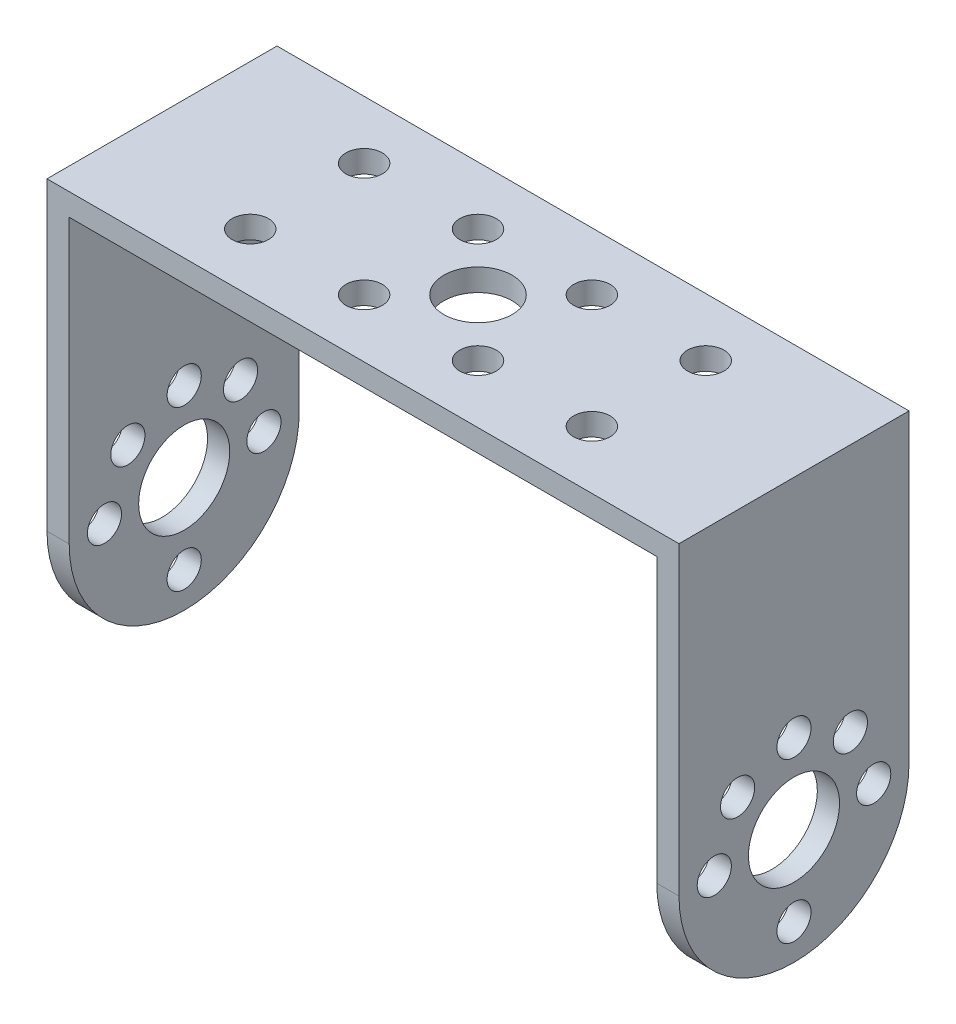
ISO-10303-21;
HEADER;
FILE_DESCRIPTION(('STEP AP214'),'2;1');
FILE_NAME('part.step','',(''),(''),'','','');
FILE_SCHEMA(('AUTOMOTIVE_DESIGN { 1 0 10303 214 1 1 1 1 }'));
ENDSEC;
DATA;
#1=APPLICATION_CONTEXT('core data for automotive mechanical design processes');
#2=APPLICATION_PROTOCOL_DEFINITION('international standard','automotive_design',2000,#1);
#3=PRODUCT_CONTEXT('',#1,'mechanical');
#4=PRODUCT('Part','Part','',(#3));
#5=PRODUCT_RELATED_PRODUCT_CATEGORY('part','',(#4));
#6=PRODUCT_DEFINITION_FORMATION('','',#4);
#7=PRODUCT_DEFINITION_CONTEXT('part definition',#1,'design');
#8=PRODUCT_DEFINITION('design','',#6,#7);
#9=PRODUCT_DEFINITION_SHAPE('','',#8);
#10=(LENGTH_UNIT() NAMED_UNIT(*) SI_UNIT(.MILLI.,.METRE.));
#11=(NAMED_UNIT(*) PLANE_ANGLE_UNIT() SI_UNIT($,.RADIAN.));
#12=(NAMED_UNIT(*) SI_UNIT($,.STERADIAN.) SOLID_ANGLE_UNIT());
#13=UNCERTAINTY_MEASURE_WITH_UNIT(LENGTH_MEASURE(1.E-05),#10,'distance_accuracy_value','');
#14=(GEOMETRIC_REPRESENTATION_CONTEXT(3) GLOBAL_UNCERTAINTY_ASSIGNED_CONTEXT((#13)) GLOBAL_UNIT_ASSIGNED_CONTEXT((#10,
#11,#12)) REPRESENTATION_CONTEXT('',''));
#15=CARTESIAN_POINT('',(0.,0.,0.));
#16=DIRECTION('',(0.,0.,1.));
#17=DIRECTION('',(1.,0.,0.));
#18=AXIS2_PLACEMENT_3D('',#15,#16,#17);
#19=CARTESIAN_POINT('',(-25.8,0.,10.1));
#20=DIRECTION('',(-1.,0.,0.));
#21=DIRECTION('',(0.,-1.,0.));
#22=AXIS2_PLACEMENT_3D('',#19,#20,#21);
#23=PLANE('',#22);
#24=CARTESIAN_POINT('',(-25.8,15.0497474683058,-4.94974746830583));
#25=DIRECTION('',(-1.,0.,0.));
#26=DIRECTION('',(0.,-1.,0.));
#27=AXIS2_PLACEMENT_3D('',#24,#25,#26);
#28=CIRCLE('',#27,1.5);
#29=CARTESIAN_POINT('',(-25.8,13.5497474683058,-4.94974746830583));
#30=VERTEX_POINT('',#29);
#31=EDGE_CURVE('E223',#30,#30,#28,.T.);
#32=ORIENTED_EDGE('',*,*,#31,.T.);
#33=EDGE_LOOP('',(#32));
#34=FACE_BOUND('',#33,.T.);
#35=CARTESIAN_POINT('',(-25.8,10.1,-7.));
#36=DIRECTION('',(-1.,0.,0.));
#37=DIRECTION('',(0.,-1.,0.));
#38=AXIS2_PLACEMENT_3D('',#35,#36,#37);
#39=CIRCLE('',#38,1.5);
#40=CARTESIAN_POINT('',(-25.8,8.60000000000001,-7.));
#41=VERTEX_POINT('',#40);
#42=EDGE_CURVE('E236',#41,#41,#39,.T.);
#43=ORIENTED_EDGE('',*,*,#42,.T.);
#44=EDGE_LOOP('',(#43));
#45=FACE_BOUND('',#44,.T.);
#46=CARTESIAN_POINT('',(-25.8,3.10000000000001,0.));
#47=DIRECTION('',(-1.,0.,0.));
#48=DIRECTION('',(0.,-1.,0.));
#49=AXIS2_PLACEMENT_3D('',#46,#47,#48);
#50=CIRCLE('',#49,1.5);
#51=CARTESIAN_POINT('',(-25.8,1.60000000000001,0.));
#52=VERTEX_POINT('',#51);
#53=EDGE_CURVE('E242',#52,#52,#50,.T.);
#54=ORIENTED_EDGE('',*,*,#53,.T.);
#55=EDGE_LOOP('',(#54));
#56=FACE_BOUND('',#55,.T.);
#57=CARTESIAN_POINT('',(-25.8,17.1,0.));
#58=DIRECTION('',(-1.,0.,0.));
#59=DIRECTION('',(0.,-1.,0.));
#60=AXIS2_PLACEMENT_3D('',#57,#58,#59);
#61=CIRCLE('',#60,1.5);
#62=CARTESIAN_POINT('',(-25.8,15.6,0.));
#63=VERTEX_POINT('',#62);
#64=EDGE_CURVE('E248',#63,#63,#61,.T.);
#65=ORIENTED_EDGE('',*,*,#64,.T.);
#66=EDGE_LOOP('',(#65));
#67=FACE_BOUND('',#66,.T.);
#68=CARTESIAN_POINT('',(-25.8,15.0497474683058,4.94974746830583));
#69=DIRECTION('',(-1.,0.,0.));
#70=DIRECTION('',(0.,-1.,0.));
#71=AXIS2_PLACEMENT_3D('',#68,#69,#70);
#72=CIRCLE('',#71,1.5);
#73=CARTESIAN_POINT('',(-25.8,13.5497474683058,4.94974746830583));
#74=VERTEX_POINT('',#73);
#75=EDGE_CURVE('E254',#74,#74,#72,.T.);
#76=ORIENTED_EDGE('',*,*,#75,.T.);
#77=EDGE_LOOP('',(#76));
#78=FACE_BOUND('',#77,.T.);
#79=CARTESIAN_POINT('',(-25.8,10.1,7.));
#80=DIRECTION('',(-1.,0.,0.));
#81=DIRECTION('',(0.,-1.,0.));
#82=AXIS2_PLACEMENT_3D('',#79,#80,#81);
#83=CIRCLE('',#82,1.5);
#84=CARTESIAN_POINT('',(-25.8,8.60000000000001,7.));
#85=VERTEX_POINT('',#84);
#86=EDGE_CURVE('E260',#85,#85,#83,.T.);
#87=ORIENTED_EDGE('',*,*,#86,.T.);
#88=EDGE_LOOP('',(#87));
#89=FACE_BOUND('',#88,.T.);
#90=CARTESIAN_POINT('',(-25.8,10.1,0.));
#91=DIRECTION('',(-1.,0.,0.));
#92=DIRECTION('',(0.,-1.,0.));
#93=AXIS2_PLACEMENT_3D('',#90,#91,#92);
#94=CIRCLE('',#93,4.);
#95=CARTESIAN_POINT('',(-25.8,6.10000000000001,0.));
#96=VERTEX_POINT('',#95);
#97=EDGE_CURVE('E266',#96,#96,#94,.T.);
#98=ORIENTED_EDGE('',*,*,#97,.T.);
#99=EDGE_LOOP('',(#98));
#100=FACE_BOUND('',#99,.T.);
#101=CARTESIAN_POINT('',(-25.8,10.1,0.));
#102=DIRECTION('',(-1.,0.,0.));
#103=DIRECTION('',(0.,-1.,0.));
#104=AXIS2_PLACEMENT_3D('',#101,#102,#103);
#105=CIRCLE('',#104,10.1);
#106=CARTESIAN_POINT('',(-25.8,10.1,-10.1));
#107=VERTEX_POINT('',#106);
#108=CARTESIAN_POINT('',(-25.8,10.1,10.1));
#109=VERTEX_POINT('',#108);
#110=EDGE_CURVE('E53',#107,#109,#105,.T.);
#111=ORIENTED_EDGE('',*,*,#110,.F.);
#112=DIRECTION('',(0.,1.,0.));
#113=VECTOR('',#112,1.);
#114=CARTESIAN_POINT('',(-25.8,0.,-10.1));
#115=LINE('',#114,#113);
#116=CARTESIAN_POINT('',(-25.8,34.95,-10.1));
#117=VERTEX_POINT('',#116);
#118=EDGE_CURVE('E110',#107,#117,#115,.T.);
#119=ORIENTED_EDGE('',*,*,#118,.T.);
#120=DIRECTION('',(0.,0.,-1.));
#121=VECTOR('',#120,1.);
#122=CARTESIAN_POINT('',(-25.8,34.95,10.1));
#123=LINE('',#122,#121);
#124=CARTESIAN_POINT('',(-25.8,34.95,10.1));
#125=VERTEX_POINT('',#124);
#126=EDGE_CURVE('E134',#125,#117,#123,.T.);
#127=ORIENTED_EDGE('',*,*,#126,.F.);
#128=DIRECTION('',(0.,1.,0.));
#129=VECTOR('',#128,1.);
#130=CARTESIAN_POINT('',(-25.8,0.,10.1));
#131=LINE('',#130,#129);
#132=EDGE_CURVE('E117',#109,#125,#131,.T.);
#133=ORIENTED_EDGE('',*,*,#132,.F.);
#134=EDGE_LOOP('',(#111,#119,#127,#133));
#135=FACE_BOUND('',#134,.T.);
#136=ADVANCED_FACE('F32',(#34,#45,#56,#67,#78,#89,#100,#135),#23,.F.);
#137=CARTESIAN_POINT('',(25.8,0.,10.1));
#138=DIRECTION('',(1.,0.,0.));
#139=DIRECTION('',(0.,1.,0.));
#140=AXIS2_PLACEMENT_3D('',#137,#138,#139);
#141=PLANE('',#140);
#142=CARTESIAN_POINT('',(25.8,15.0497474683058,-4.94974746830583));
#143=DIRECTION('',(1.,0.,0.));
#144=DIRECTION('',(0.,1.,0.));
#145=AXIS2_PLACEMENT_3D('',#142,#143,#144);
#146=CIRCLE('',#145,1.5);
#147=CARTESIAN_POINT('',(25.8,16.5497474683058,-4.94974746830583));
#148=VERTEX_POINT('',#147);
#149=EDGE_CURVE('E233',#148,#148,#146,.T.);
#150=ORIENTED_EDGE('',*,*,#149,.T.);
#151=EDGE_LOOP('',(#150));
#152=FACE_BOUND('',#151,.T.);
#153=CARTESIAN_POINT('',(25.8,10.1,-7.));
#154=DIRECTION('',(1.,0.,0.));
#155=DIRECTION('',(0.,1.,0.));
#156=AXIS2_PLACEMENT_3D('',#153,#154,#155);
#157=CIRCLE('',#156,1.5);
#158=CARTESIAN_POINT('',(25.8,11.6,-7.));
#159=VERTEX_POINT('',#158);
#160=EDGE_CURVE('E239',#159,#159,#157,.T.);
#161=ORIENTED_EDGE('',*,*,#160,.T.);
#162=EDGE_LOOP('',(#161));
#163=FACE_BOUND('',#162,.T.);
#164=CARTESIAN_POINT('',(25.8,3.1,0.));
#165=DIRECTION('',(1.,0.,0.));
#166=DIRECTION('',(0.,1.,0.));
#167=AXIS2_PLACEMENT_3D('',#164,#165,#166);
#168=CIRCLE('',#167,1.5);
#169=CARTESIAN_POINT('',(25.8,4.6,0.));
#170=VERTEX_POINT('',#169);
#171=EDGE_CURVE('E245',#170,#170,#168,.T.);
#172=ORIENTED_EDGE('',*,*,#171,.T.);
#173=EDGE_LOOP('',(#172));
#174=FACE_BOUND('',#173,.T.);
#175=CARTESIAN_POINT('',(25.8,17.1,0.));
#176=DIRECTION('',(1.,0.,0.));
#177=DIRECTION('',(0.,1.,0.));
#178=AXIS2_PLACEMENT_3D('',#175,#176,#177);
#179=CIRCLE('',#178,1.5);
#180=CARTESIAN_POINT('',(25.8,18.6,0.));
#181=VERTEX_POINT('',#180);
#182=EDGE_CURVE('E251',#181,#181,#179,.T.);
#183=ORIENTED_EDGE('',*,*,#182,.T.);
#184=EDGE_LOOP('',(#183));
#185=FACE_BOUND('',#184,.T.);
#186=CARTESIAN_POINT('',(25.8,15.0497474683058,4.94974746830583));
#187=DIRECTION('',(1.,0.,0.));
#188=DIRECTION('',(0.,1.,0.));
#189=AXIS2_PLACEMENT_3D('',#186,#187,#188);
#190=CIRCLE('',#189,1.5);
#191=CARTESIAN_POINT('',(25.8,16.5497474683058,4.94974746830583));
#192=VERTEX_POINT('',#191);
#193=EDGE_CURVE('E257',#192,#192,#190,.T.);
#194=ORIENTED_EDGE('',*,*,#193,.T.);
#195=EDGE_LOOP('',(#194));
#196=FACE_BOUND('',#195,.T.);
#197=CARTESIAN_POINT('',(25.8,10.1,7.));
#198=DIRECTION('',(1.,0.,0.));
#199=DIRECTION('',(0.,1.,0.));
#200=AXIS2_PLACEMENT_3D('',#197,#198,#199);
#201=CIRCLE('',#200,1.5);
#202=CARTESIAN_POINT('',(25.8,11.6,7.));
#203=VERTEX_POINT('',#202);
#204=EDGE_CURVE('E263',#203,#203,#201,.T.);
#205=ORIENTED_EDGE('',*,*,#204,.T.);
#206=EDGE_LOOP('',(#205));
#207=FACE_BOUND('',#206,.T.);
#208=CARTESIAN_POINT('',(25.8,10.1,0.));
#209=DIRECTION('',(1.,0.,0.));
#210=DIRECTION('',(0.,1.,0.));
#211=AXIS2_PLACEMENT_3D('',#208,#209,#210);
#212=CIRCLE('',#211,4.);
#213=CARTESIAN_POINT('',(25.8,14.1,0.));
#214=VERTEX_POINT('',#213);
#215=EDGE_CURVE('E269',#214,#214,#212,.T.);
#216=ORIENTED_EDGE('',*,*,#215,.T.);
#217=EDGE_LOOP('',(#216));
#218=FACE_BOUND('',#217,.T.);
#219=DIRECTION('',(0.,-1.,0.));
#220=VECTOR('',#219,1.);
#221=CARTESIAN_POINT('',(25.8,0.,-10.1));
#222=LINE('',#221,#220);
#223=CARTESIAN_POINT('',(25.8,34.95,-10.1));
#224=VERTEX_POINT('',#223);
#225=CARTESIAN_POINT('',(25.8,10.1,-10.1));
#226=VERTEX_POINT('',#225);
#227=EDGE_CURVE('E158',#224,#226,#222,.T.);
#228=ORIENTED_EDGE('',*,*,#227,.T.);
#229=CARTESIAN_POINT('',(25.8,10.1,0.));
#230=DIRECTION('',(1.,0.,0.));
#231=DIRECTION('',(0.,1.,0.));
#232=AXIS2_PLACEMENT_3D('',#229,#230,#231);
#233=CIRCLE('',#232,10.1);
#234=CARTESIAN_POINT('',(25.8,10.1,10.1));
#235=VERTEX_POINT('',#234);
#236=EDGE_CURVE('E166',#235,#226,#233,.T.);
#237=ORIENTED_EDGE('',*,*,#236,.F.);
#238=DIRECTION('',(0.,-1.,0.));
#239=VECTOR('',#238,1.);
#240=CARTESIAN_POINT('',(25.8,0.,10.1));
#241=LINE('',#240,#239);
#242=CARTESIAN_POINT('',(25.8,34.95,10.1));
#243=VERTEX_POINT('',#242);
#244=EDGE_CURVE('E143',#243,#235,#241,.T.);
#245=ORIENTED_EDGE('',*,*,#244,.F.);
#246=DIRECTION('',(0.,0.,-1.));
#247=VECTOR('',#246,1.);
#248=CARTESIAN_POINT('',(25.8,34.95,10.1));
#249=LINE('',#248,#247);
#250=EDGE_CURVE('E131',#243,#224,#249,.T.);
#251=ORIENTED_EDGE('',*,*,#250,.T.);
#252=EDGE_LOOP('',(#228,#237,#245,#251));
#253=FACE_BOUND('',#252,.T.);
#254=ADVANCED_FACE('F328',(#152,#163,#174,#185,#196,#207,#218,#253),#141,.F.);
#255=CARTESIAN_POINT('',(27.75,36.9,10.1));
#256=DIRECTION('',(-1.,0.,0.));
#257=DIRECTION('',(0.,-1.,0.));
#258=AXIS2_PLACEMENT_3D('',#255,#256,#257);
#259=PLANE('',#258);
#260=CARTESIAN_POINT('',(27.75,15.0497474683058,-4.94974746830583));
#261=DIRECTION('',(1.,0.,0.));
#262=DIRECTION('',(0.,-1.,0.));
#263=AXIS2_PLACEMENT_3D('',#260,#261,#262);
#264=CIRCLE('',#263,1.5);
#265=CARTESIAN_POINT('',(27.75,13.5497474683058,-4.94974746830583));
#266=VERTEX_POINT('',#265);
#267=EDGE_CURVE('E279',#266,#266,#264,.T.);
#268=ORIENTED_EDGE('',*,*,#267,.F.);
#269=EDGE_LOOP('',(#268));
#270=FACE_BOUND('',#269,.T.);
#271=CARTESIAN_POINT('',(27.75,10.1,-7.));
#272=DIRECTION('',(1.,0.,0.));
#273=DIRECTION('',(0.,-1.,0.));
#274=AXIS2_PLACEMENT_3D('',#271,#272,#273);
#275=CIRCLE('',#274,1.5);
#276=CARTESIAN_POINT('',(27.75,8.6,-7.));
#277=VERTEX_POINT('',#276);
#278=EDGE_CURVE('E285',#277,#277,#275,.T.);
#279=ORIENTED_EDGE('',*,*,#278,.F.);
#280=EDGE_LOOP('',(#279));
#281=FACE_BOUND('',#280,.T.);
#282=CARTESIAN_POINT('',(27.75,3.1,0.));
#283=DIRECTION('',(1.,0.,0.));
#284=DIRECTION('',(0.,1.,0.));
#285=AXIS2_PLACEMENT_3D('',#282,#283,#284);
#286=CIRCLE('',#285,1.5);
#287=CARTESIAN_POINT('',(27.75,4.6,0.));
#288=VERTEX_POINT('',#287);
#289=EDGE_CURVE('E291',#288,#288,#286,.T.);
#290=ORIENTED_EDGE('',*,*,#289,.F.);
#291=EDGE_LOOP('',(#290));
#292=FACE_BOUND('',#291,.T.);
#293=CARTESIAN_POINT('',(27.75,17.1,0.));
#294=DIRECTION('',(1.,0.,0.));
#295=DIRECTION('',(0.,1.,0.));
#296=AXIS2_PLACEMENT_3D('',#293,#294,#295);
#297=CIRCLE('',#296,1.5);
#298=CARTESIAN_POINT('',(27.75,18.6,0.));
#299=VERTEX_POINT('',#298);
#300=EDGE_CURVE('E297',#299,#299,#297,.T.);
#301=ORIENTED_EDGE('',*,*,#300,.F.);
#302=EDGE_LOOP('',(#301));
#303=FACE_BOUND('',#302,.T.);
#304=CARTESIAN_POINT('',(27.75,15.0497474683058,4.94974746830583));
#305=DIRECTION('',(1.,0.,0.));
#306=DIRECTION('',(0.,1.,0.));
#307=AXIS2_PLACEMENT_3D('',#304,#305,#306);
#308=CIRCLE('',#307,1.5);
#309=CARTESIAN_POINT('',(27.75,16.5497474683058,4.94974746830583));
#310=VERTEX_POINT('',#309);
#311=EDGE_CURVE('E303',#310,#310,#308,.T.);
#312=ORIENTED_EDGE('',*,*,#311,.F.);
#313=EDGE_LOOP('',(#312));
#314=FACE_BOUND('',#313,.T.);
#315=CARTESIAN_POINT('',(27.75,10.1,7.));
#316=DIRECTION('',(1.,0.,0.));
#317=DIRECTION('',(0.,1.,0.));
#318=AXIS2_PLACEMENT_3D('',#315,#316,#317);
#319=CIRCLE('',#318,1.5);
#320=CARTESIAN_POINT('',(27.75,11.6,7.));
#321=VERTEX_POINT('',#320);
#322=EDGE_CURVE('E309',#321,#321,#319,.T.);
#323=ORIENTED_EDGE('',*,*,#322,.F.);
#324=EDGE_LOOP('',(#323));
#325=FACE_BOUND('',#324,.T.);
#326=CARTESIAN_POINT('',(27.75,10.1,0.));
#327=DIRECTION('',(1.,0.,0.));
#328=DIRECTION('',(0.,1.,0.));
#329=AXIS2_PLACEMENT_3D('',#326,#327,#328);
#330=CIRCLE('',#329,4.);
#331=CARTESIAN_POINT('',(27.75,14.1,0.));
#332=VERTEX_POINT('',#331);
#333=EDGE_CURVE('E273',#332,#332,#330,.T.);
#334=ORIENTED_EDGE('',*,*,#333,.F.);
#335=EDGE_LOOP('',(#334));
#336=FACE_BOUND('',#335,.T.);
#337=CARTESIAN_POINT('',(27.75,10.1,0.));
#338=DIRECTION('',(1.,0.,0.));
#339=DIRECTION('',(0.,1.,0.));
#340=AXIS2_PLACEMENT_3D('',#337,#338,#339);
#341=CIRCLE('',#340,10.1);
#342=CARTESIAN_POINT('',(27.75,10.1,10.1));
#343=VERTEX_POINT('',#342);
#344=CARTESIAN_POINT('',(27.75,10.1,-10.1));
#345=VERTEX_POINT('',#344);
#346=EDGE_CURVE('E45',#343,#345,#341,.T.);
#347=ORIENTED_EDGE('',*,*,#346,.T.);
#348=DIRECTION('',(0.,1.,0.));
#349=VECTOR('',#348,1.);
#350=CARTESIAN_POINT('',(27.75,36.9,-10.1));
#351=LINE('',#350,#349);
#352=CARTESIAN_POINT('',(27.75,36.9,-10.1));
#353=VERTEX_POINT('',#352);
#354=EDGE_CURVE('E122',#345,#353,#351,.T.);
#355=ORIENTED_EDGE('',*,*,#354,.T.);
#356=DIRECTION('',(0.,0.,-1.));
#357=VECTOR('',#356,1.);
#358=CARTESIAN_POINT('',(27.75,36.9,10.1));
#359=LINE('',#358,#357);
#360=CARTESIAN_POINT('',(27.75,36.9,10.1));
#361=VERTEX_POINT('',#360);
#362=EDGE_CURVE('E127',#361,#353,#359,.T.);
#363=ORIENTED_EDGE('',*,*,#362,.F.);
#364=DIRECTION('',(0.,1.,0.));
#365=VECTOR('',#364,1.);
#366=CARTESIAN_POINT('',(27.75,36.9,10.1));
#367=LINE('',#366,#365);
#368=EDGE_CURVE('E140',#343,#361,#367,.T.);
#369=ORIENTED_EDGE('',*,*,#368,.F.);
#370=EDGE_LOOP('',(#347,#355,#363,#369));
#371=FACE_BOUND('',#370,.T.);
#372=ADVANCED_FACE('F146',(#270,#281,#292,#303,#314,#325,#336,#371),#259,.F.);
#373=CARTESIAN_POINT('',(-27.75,36.9,10.1));
#374=DIRECTION('',(1.,0.,0.));
#375=DIRECTION('',(0.,1.,0.));
#376=AXIS2_PLACEMENT_3D('',#373,#374,#375);
#377=PLANE('',#376);
#378=CARTESIAN_POINT('',(-27.75,15.0497474683058,-4.94974746830583));
#379=DIRECTION('',(1.,0.,0.));
#380=DIRECTION('',(0.,-1.,0.));
#381=AXIS2_PLACEMENT_3D('',#378,#379,#380);
#382=CIRCLE('',#381,1.5);
#383=CARTESIAN_POINT('',(-27.75,13.5497474683058,-4.94974746830583));
#384=VERTEX_POINT('',#383);
#385=EDGE_CURVE('E282',#384,#384,#382,.T.);
#386=ORIENTED_EDGE('',*,*,#385,.T.);
#387=EDGE_LOOP('',(#386));
#388=FACE_BOUND('',#387,.T.);
#389=CARTESIAN_POINT('',(-27.75,10.1,-7.));
#390=DIRECTION('',(1.,0.,0.));
#391=DIRECTION('',(0.,-1.,0.));
#392=AXIS2_PLACEMENT_3D('',#389,#390,#391);
#393=CIRCLE('',#392,1.5);
#394=CARTESIAN_POINT('',(-27.75,8.60000000000001,-7.));
#395=VERTEX_POINT('',#394);
#396=EDGE_CURVE('E288',#395,#395,#393,.T.);
#397=ORIENTED_EDGE('',*,*,#396,.T.);
#398=EDGE_LOOP('',(#397));
#399=FACE_BOUND('',#398,.T.);
#400=CARTESIAN_POINT('',(-27.75,3.10000000000001,0.));
#401=DIRECTION('',(1.,0.,0.));
#402=DIRECTION('',(0.,1.,0.));
#403=AXIS2_PLACEMENT_3D('',#400,#401,#402);
#404=CIRCLE('',#403,1.5);
#405=CARTESIAN_POINT('',(-27.75,4.60000000000001,0.));
#406=VERTEX_POINT('',#405);
#407=EDGE_CURVE('E294',#406,#406,#404,.T.);
#408=ORIENTED_EDGE('',*,*,#407,.T.);
#409=EDGE_LOOP('',(#408));
#410=FACE_BOUND('',#409,.T.);
#411=CARTESIAN_POINT('',(-27.75,17.1,0.));
#412=DIRECTION('',(1.,0.,0.));
#413=DIRECTION('',(0.,1.,0.));
#414=AXIS2_PLACEMENT_3D('',#411,#412,#413);
#415=CIRCLE('',#414,1.5);
#416=CARTESIAN_POINT('',(-27.75,18.6,0.));
#417=VERTEX_POINT('',#416);
#418=EDGE_CURVE('E300',#417,#417,#415,.T.);
#419=ORIENTED_EDGE('',*,*,#418,.T.);
#420=EDGE_LOOP('',(#419));
#421=FACE_BOUND('',#420,.T.);
#422=CARTESIAN_POINT('',(-27.75,15.0497474683058,4.94974746830583));
#423=DIRECTION('',(1.,0.,0.));
#424=DIRECTION('',(0.,1.,0.));
#425=AXIS2_PLACEMENT_3D('',#422,#423,#424);
#426=CIRCLE('',#425,1.5);
#427=CARTESIAN_POINT('',(-27.75,16.5497474683058,4.94974746830583));
#428=VERTEX_POINT('',#427);
#429=EDGE_CURVE('E306',#428,#428,#426,.T.);
#430=ORIENTED_EDGE('',*,*,#429,.T.);
#431=EDGE_LOOP('',(#430));
#432=FACE_BOUND('',#431,.T.);
#433=CARTESIAN_POINT('',(-27.75,10.1,7.));
#434=DIRECTION('',(1.,0.,0.));
#435=DIRECTION('',(0.,1.,0.));
#436=AXIS2_PLACEMENT_3D('',#433,#434,#435);
#437=CIRCLE('',#436,1.5);
#438=CARTESIAN_POINT('',(-27.75,11.6,7.));
#439=VERTEX_POINT('',#438);
#440=EDGE_CURVE('E276',#439,#439,#437,.T.);
#441=ORIENTED_EDGE('',*,*,#440,.T.);
#442=EDGE_LOOP('',(#441));
#443=FACE_BOUND('',#442,.T.);
#444=CARTESIAN_POINT('',(-27.75,10.1,0.));
#445=DIRECTION('',(1.,0.,0.));
#446=DIRECTION('',(0.,1.,0.));
#447=AXIS2_PLACEMENT_3D('',#444,#445,#446);
#448=CIRCLE('',#447,4.);
#449=CARTESIAN_POINT('',(-27.75,14.1,0.));
#450=VERTEX_POINT('',#449);
#451=EDGE_CURVE('E272',#450,#450,#448,.T.);
#452=ORIENTED_EDGE('',*,*,#451,.T.);
#453=EDGE_LOOP('',(#452));
#454=FACE_BOUND('',#453,.T.);
#455=DIRECTION('',(0.,-1.,0.));
#456=VECTOR('',#455,1.);
#457=CARTESIAN_POINT('',(-27.75,36.9,-10.1));
#458=LINE('',#457,#456);
#459=CARTESIAN_POINT('',(-27.75,36.9,-10.1));
#460=VERTEX_POINT('',#459);
#461=CARTESIAN_POINT('',(-27.75,10.1,-10.1));
#462=VERTEX_POINT('',#461);
#463=EDGE_CURVE('E108',#460,#462,#458,.T.);
#464=ORIENTED_EDGE('',*,*,#463,.T.);
#465=CARTESIAN_POINT('',(-27.75,10.1,0.));
#466=DIRECTION('',(1.,0.,0.));
#467=DIRECTION('',(0.,1.,0.));
#468=AXIS2_PLACEMENT_3D('',#465,#466,#467);
#469=CIRCLE('',#468,10.1);
#470=CARTESIAN_POINT('',(-27.75,10.1,10.1));
#471=VERTEX_POINT('',#470);
#472=EDGE_CURVE('E93',#471,#462,#469,.T.);
#473=ORIENTED_EDGE('',*,*,#472,.F.);
#474=DIRECTION('',(0.,-1.,0.));
#475=VECTOR('',#474,1.);
#476=CARTESIAN_POINT('',(-27.75,36.9,10.1));
#477=LINE('',#476,#475);
#478=CARTESIAN_POINT('',(-27.75,36.9,10.1));
#479=VERTEX_POINT('',#478);
#480=EDGE_CURVE('E128',#479,#471,#477,.T.);
#481=ORIENTED_EDGE('',*,*,#480,.F.);
#482=DIRECTION('',(0.,0.,-1.));
#483=VECTOR('',#482,1.);
#484=CARTESIAN_POINT('',(-27.75,36.9,10.1));
#485=LINE('',#484,#483);
#486=EDGE_CURVE('E116',#479,#460,#485,.T.);
#487=ORIENTED_EDGE('',*,*,#486,.T.);
#488=EDGE_LOOP('',(#464,#473,#481,#487));
#489=FACE_BOUND('',#488,.T.);
#490=ADVANCED_FACE('F114',(#388,#399,#410,#421,#432,#443,#454,#489),#377,.F.);
#491=CARTESIAN_POINT('',(0.,0.,-10.1));
#492=DIRECTION('',(0.,0.,1.));
#493=DIRECTION('',(1.,0.,0.));
#494=AXIS2_PLACEMENT_3D('',#491,#492,#493);
#495=PLANE('',#494);
#496=DIRECTION('',(1.,0.,0.));
#497=VECTOR('',#496,1.);
#498=CARTESIAN_POINT('',(-27.75,10.1,-10.1));
#499=LINE('',#498,#497);
#500=EDGE_CURVE('E96',#462,#107,#499,.T.);
#501=ORIENTED_EDGE('',*,*,#500,.F.);
#502=ORIENTED_EDGE('',*,*,#463,.F.);
#503=DIRECTION('',(-1.,0.,0.));
#504=VECTOR('',#503,1.);
#505=CARTESIAN_POINT('',(-27.75,36.9,-10.1));
#506=LINE('',#505,#504);
#507=EDGE_CURVE('E118',#353,#460,#506,.T.);
#508=ORIENTED_EDGE('',*,*,#507,.F.);
#509=ORIENTED_EDGE('',*,*,#354,.F.);
#510=DIRECTION('',(1.,0.,0.));
#511=VECTOR('',#510,1.);
#512=CARTESIAN_POINT('',(-27.75,10.1,-10.1));
#513=LINE('',#512,#511);
#514=EDGE_CURVE('E11',#226,#345,#513,.T.);
#515=ORIENTED_EDGE('',*,*,#514,.F.);
#516=ORIENTED_EDGE('',*,*,#227,.F.);
#517=DIRECTION('',(1.,0.,0.));
#518=VECTOR('',#517,1.);
#519=CARTESIAN_POINT('',(25.8,34.95,-10.1));
#520=LINE('',#519,#518);
#521=EDGE_CURVE('E156',#117,#224,#520,.T.);
#522=ORIENTED_EDGE('',*,*,#521,.F.);
#523=ORIENTED_EDGE('',*,*,#118,.F.);
#524=EDGE_LOOP('',(#501,#502,#508,#509,#515,#516,#522,#523));
#525=FACE_BOUND('',#524,.T.);
#526=ADVANCED_FACE('F106',(#525),#495,.F.);
#527=CARTESIAN_POINT('',(0.,0.,10.1));
#528=DIRECTION('',(0.,0.,1.));
#529=DIRECTION('',(1.,0.,0.));
#530=AXIS2_PLACEMENT_3D('',#527,#528,#529);
#531=PLANE('',#530);
#532=ORIENTED_EDGE('',*,*,#480,.T.);
#533=DIRECTION('',(1.,0.,0.));
#534=VECTOR('',#533,1.);
#535=CARTESIAN_POINT('',(-27.75,10.1,10.1));
#536=LINE('',#535,#534);
#537=EDGE_CURVE('E98',#471,#109,#536,.T.);
#538=ORIENTED_EDGE('',*,*,#537,.T.);
#539=ORIENTED_EDGE('',*,*,#132,.T.);
#540=DIRECTION('',(1.,0.,0.));
#541=VECTOR('',#540,1.);
#542=CARTESIAN_POINT('',(25.8,34.95,10.1));
#543=LINE('',#542,#541);
#544=EDGE_CURVE('E120',#125,#243,#543,.T.);
#545=ORIENTED_EDGE('',*,*,#544,.T.);
#546=ORIENTED_EDGE('',*,*,#244,.T.);
#547=DIRECTION('',(1.,0.,0.));
#548=VECTOR('',#547,1.);
#549=CARTESIAN_POINT('',(-27.75,10.1,10.1));
#550=LINE('',#549,#548);
#551=EDGE_CURVE('E39',#235,#343,#550,.T.);
#552=ORIENTED_EDGE('',*,*,#551,.T.);
#553=ORIENTED_EDGE('',*,*,#368,.T.);
#554=DIRECTION('',(-1.,0.,0.));
#555=VECTOR('',#554,1.);
#556=CARTESIAN_POINT('',(-27.75,36.9,10.1));
#557=LINE('',#556,#555);
#558=EDGE_CURVE('E148',#361,#479,#557,.T.);
#559=ORIENTED_EDGE('',*,*,#558,.T.);
#560=EDGE_LOOP('',(#532,#538,#539,#545,#546,#552,#553,#559));
#561=FACE_BOUND('',#560,.T.);
#562=ADVANCED_FACE('F139',(#561),#531,.T.);
#563=CARTESIAN_POINT('',(25.8,34.95,10.1));
#564=DIRECTION('',(0.,1.,0.));
#565=DIRECTION('',(0.,0.,1.));
#566=AXIS2_PLACEMENT_3D('',#563,#564,#565);
#567=PLANE('',#566);
#568=CARTESIAN_POINT('',(-5.,34.95,5.));
#569=DIRECTION('',(0.,1.,0.));
#570=DIRECTION('',(0.,0.,1.));
#571=AXIS2_PLACEMENT_3D('',#568,#569,#570);
#572=CIRCLE('',#571,1.6);
#573=CARTESIAN_POINT('',(-5.,34.95,6.6));
#574=VERTEX_POINT('',#573);
#575=EDGE_CURVE('E111',#574,#574,#572,.T.);
#576=ORIENTED_EDGE('',*,*,#575,.T.);
#577=EDGE_LOOP('',(#576));
#578=FACE_BOUND('',#577,.T.);
#579=CARTESIAN_POINT('',(-5.,34.95,-5.));
#580=DIRECTION('',(0.,1.,0.));
#581=DIRECTION('',(0.,0.,1.));
#582=AXIS2_PLACEMENT_3D('',#579,#580,#581);
#583=CIRCLE('',#582,1.6);
#584=CARTESIAN_POINT('',(-5.,34.95,-3.4));
#585=VERTEX_POINT('',#584);
#586=EDGE_CURVE('E179',#585,#585,#583,.T.);
#587=ORIENTED_EDGE('',*,*,#586,.T.);
#588=EDGE_LOOP('',(#587));
#589=FACE_BOUND('',#588,.T.);
#590=CARTESIAN_POINT('',(5.,34.95,5.));
#591=DIRECTION('',(0.,1.,0.));
#592=DIRECTION('',(0.,0.,1.));
#593=AXIS2_PLACEMENT_3D('',#590,#591,#592);
#594=CIRCLE('',#593,1.6);
#595=CARTESIAN_POINT('',(5.,34.95,6.6));
#596=VERTEX_POINT('',#595);
#597=EDGE_CURVE('E182',#596,#596,#594,.T.);
#598=ORIENTED_EDGE('',*,*,#597,.T.);
#599=EDGE_LOOP('',(#598));
#600=FACE_BOUND('',#599,.T.);
#601=CARTESIAN_POINT('',(5.,34.95,-5.));
#602=DIRECTION('',(0.,1.,0.));
#603=DIRECTION('',(0.,0.,1.));
#604=AXIS2_PLACEMENT_3D('',#601,#602,#603);
#605=CIRCLE('',#604,1.6);
#606=CARTESIAN_POINT('',(5.,34.95,-3.4));
#607=VERTEX_POINT('',#606);
#608=EDGE_CURVE('E185',#607,#607,#605,.T.);
#609=ORIENTED_EDGE('',*,*,#608,.T.);
#610=EDGE_LOOP('',(#609));
#611=FACE_BOUND('',#610,.T.);
#612=CARTESIAN_POINT('',(-15.,34.95,-5.));
#613=DIRECTION('',(0.,1.,0.));
#614=DIRECTION('',(0.,0.,1.));
#615=AXIS2_PLACEMENT_3D('',#612,#613,#614);
#616=CIRCLE('',#615,1.6);
#617=CARTESIAN_POINT('',(-15.,34.95,-3.4));
#618=VERTEX_POINT('',#617);
#619=EDGE_CURVE('E188',#618,#618,#616,.T.);
#620=ORIENTED_EDGE('',*,*,#619,.T.);
#621=EDGE_LOOP('',(#620));
#622=FACE_BOUND('',#621,.T.);
#623=CARTESIAN_POINT('',(-15.,34.95,5.));
#624=DIRECTION('',(0.,1.,0.));
#625=DIRECTION('',(0.,0.,1.));
#626=AXIS2_PLACEMENT_3D('',#623,#624,#625);
#627=CIRCLE('',#626,1.6);
#628=CARTESIAN_POINT('',(-15.,34.95,6.6));
#629=VERTEX_POINT('',#628);
#630=EDGE_CURVE('E191',#629,#629,#627,.T.);
#631=ORIENTED_EDGE('',*,*,#630,.T.);
#632=EDGE_LOOP('',(#631));
#633=FACE_BOUND('',#632,.T.);
#634=CARTESIAN_POINT('',(15.,34.95,5.));
#635=DIRECTION('',(0.,1.,0.));
#636=DIRECTION('',(0.,0.,1.));
#637=AXIS2_PLACEMENT_3D('',#634,#635,#636);
#638=CIRCLE('',#637,1.6);
#639=CARTESIAN_POINT('',(15.,34.95,6.6));
#640=VERTEX_POINT('',#639);
#641=EDGE_CURVE('E194',#640,#640,#638,.T.);
#642=ORIENTED_EDGE('',*,*,#641,.T.);
#643=EDGE_LOOP('',(#642));
#644=FACE_BOUND('',#643,.T.);
#645=CARTESIAN_POINT('',(15.,34.95,-5.));
#646=DIRECTION('',(0.,1.,0.));
#647=DIRECTION('',(0.,0.,1.));
#648=AXIS2_PLACEMENT_3D('',#645,#646,#647);
#649=CIRCLE('',#648,1.6);
#650=CARTESIAN_POINT('',(15.,34.95,-3.4));
#651=VERTEX_POINT('',#650);
#652=EDGE_CURVE('E197',#651,#651,#649,.T.);
#653=ORIENTED_EDGE('',*,*,#652,.T.);
#654=EDGE_LOOP('',(#653));
#655=FACE_BOUND('',#654,.T.);
#656=CARTESIAN_POINT('',(0.,34.95,0.));
#657=DIRECTION('',(0.,1.,0.));
#658=DIRECTION('',(0.,0.,1.));
#659=AXIS2_PLACEMENT_3D('',#656,#657,#658);
#660=CIRCLE('',#659,3.);
#661=CARTESIAN_POINT('',(0.,34.95,3.));
#662=VERTEX_POINT('',#661);
#663=EDGE_CURVE('E200',#662,#662,#660,.T.);
#664=ORIENTED_EDGE('',*,*,#663,.T.);
#665=EDGE_LOOP('',(#664));
#666=FACE_BOUND('',#665,.T.);
#667=ORIENTED_EDGE('',*,*,#521,.T.);
#668=ORIENTED_EDGE('',*,*,#250,.F.);
#669=ORIENTED_EDGE('',*,*,#544,.F.);
#670=ORIENTED_EDGE('',*,*,#126,.T.);
#671=EDGE_LOOP('',(#667,#668,#669,#670));
#672=FACE_BOUND('',#671,.T.);
#673=ADVANCED_FACE('F171',(#578,#589,#600,#611,#622,#633,#644,#655,#666,#672),#567,.F.);
#674=CARTESIAN_POINT('',(-27.75,36.9,10.1));
#675=DIRECTION('',(0.,-1.,0.));
#676=DIRECTION('',(0.,0.,-1.));
#677=AXIS2_PLACEMENT_3D('',#674,#675,#676);
#678=PLANE('',#677);
#679=CARTESIAN_POINT('',(-5.,36.9,5.));
#680=DIRECTION('',(0.,1.,0.));
#681=DIRECTION('',(0.,0.,1.));
#682=AXIS2_PLACEMENT_3D('',#679,#680,#681);
#683=CIRCLE('',#682,1.6);
#684=CARTESIAN_POINT('',(-5.,36.9,6.6));
#685=VERTEX_POINT('',#684);
#686=EDGE_CURVE('E206',#685,#685,#683,.T.);
#687=ORIENTED_EDGE('',*,*,#686,.F.);
#688=EDGE_LOOP('',(#687));
#689=FACE_BOUND('',#688,.T.);
#690=CARTESIAN_POINT('',(-5.,36.9,-5.));
#691=DIRECTION('',(0.,1.,0.));
#692=DIRECTION('',(0.,0.,1.));
#693=AXIS2_PLACEMENT_3D('',#690,#691,#692);
#694=CIRCLE('',#693,1.6);
#695=CARTESIAN_POINT('',(-5.,36.9,-3.4));
#696=VERTEX_POINT('',#695);
#697=EDGE_CURVE('E214',#696,#696,#694,.T.);
#698=ORIENTED_EDGE('',*,*,#697,.F.);
#699=EDGE_LOOP('',(#698));
#700=FACE_BOUND('',#699,.T.);
#701=CARTESIAN_POINT('',(5.,36.9,5.));
#702=DIRECTION('',(0.,1.,0.));
#703=DIRECTION('',(0.,0.,1.));
#704=AXIS2_PLACEMENT_3D('',#701,#702,#703);
#705=CIRCLE('',#704,1.6);
#706=CARTESIAN_POINT('',(5.,36.9,6.6));
#707=VERTEX_POINT('',#706);
#708=EDGE_CURVE('E210',#707,#707,#705,.T.);
#709=ORIENTED_EDGE('',*,*,#708,.F.);
#710=EDGE_LOOP('',(#709));
#711=FACE_BOUND('',#710,.T.);
#712=CARTESIAN_POINT('',(5.,36.9,-5.));
#713=DIRECTION('',(0.,1.,0.));
#714=DIRECTION('',(0.,0.,1.));
#715=AXIS2_PLACEMENT_3D('',#712,#713,#714);
#716=CIRCLE('',#715,1.6);
#717=CARTESIAN_POINT('',(5.,36.9,-3.4));
#718=VERTEX_POINT('',#717);
#719=EDGE_CURVE('E207',#718,#718,#716,.T.);
#720=ORIENTED_EDGE('',*,*,#719,.F.);
#721=EDGE_LOOP('',(#720));
#722=FACE_BOUND('',#721,.T.);
#723=CARTESIAN_POINT('',(-15.,36.9,-5.));
#724=DIRECTION('',(0.,1.,0.));
#725=DIRECTION('',(0.,0.,1.));
#726=AXIS2_PLACEMENT_3D('',#723,#724,#725);
#727=CIRCLE('',#726,1.6);
#728=CARTESIAN_POINT('',(-15.,36.9,-3.4));
#729=VERTEX_POINT('',#728);
#730=EDGE_CURVE('E211',#729,#729,#727,.T.);
#731=ORIENTED_EDGE('',*,*,#730,.F.);
#732=EDGE_LOOP('',(#731));
#733=FACE_BOUND('',#732,.T.);
#734=CARTESIAN_POINT('',(-15.,36.9,5.));
#735=DIRECTION('',(0.,1.,0.));
#736=DIRECTION('',(0.,0.,-1.));
#737=AXIS2_PLACEMENT_3D('',#734,#735,#736);
#738=CIRCLE('',#737,1.6);
#739=CARTESIAN_POINT('',(-15.,36.9,3.4));
#740=VERTEX_POINT('',#739);
#741=EDGE_CURVE('E226',#740,#740,#738,.T.);
#742=ORIENTED_EDGE('',*,*,#741,.F.);
#743=EDGE_LOOP('',(#742));
#744=FACE_BOUND('',#743,.T.);
#745=CARTESIAN_POINT('',(15.,36.9,5.));
#746=DIRECTION('',(0.,1.,0.));
#747=DIRECTION('',(0.,0.,1.));
#748=AXIS2_PLACEMENT_3D('',#745,#746,#747);
#749=CIRCLE('',#748,1.6);
#750=CARTESIAN_POINT('',(15.,36.9,6.6));
#751=VERTEX_POINT('',#750);
#752=EDGE_CURVE('E222',#751,#751,#749,.T.);
#753=ORIENTED_EDGE('',*,*,#752,.F.);
#754=EDGE_LOOP('',(#753));
#755=FACE_BOUND('',#754,.T.);
#756=CARTESIAN_POINT('',(15.,36.9,-5.));
#757=DIRECTION('',(0.,1.,0.));
#758=DIRECTION('',(0.,0.,-1.));
#759=AXIS2_PLACEMENT_3D('',#756,#757,#758);
#760=CIRCLE('',#759,1.6);
#761=CARTESIAN_POINT('',(15.,36.9,-6.6));
#762=VERTEX_POINT('',#761);
#763=EDGE_CURVE('E219',#762,#762,#760,.T.);
#764=ORIENTED_EDGE('',*,*,#763,.F.);
#765=EDGE_LOOP('',(#764));
#766=FACE_BOUND('',#765,.T.);
#767=CARTESIAN_POINT('',(0.,36.9,0.));
#768=DIRECTION('',(0.,1.,0.));
#769=DIRECTION('',(0.,0.,1.));
#770=AXIS2_PLACEMENT_3D('',#767,#768,#769);
#771=CIRCLE('',#770,3.);
#772=CARTESIAN_POINT('',(0.,36.9,3.));
#773=VERTEX_POINT('',#772);
#774=EDGE_CURVE('E203',#773,#773,#771,.T.);
#775=ORIENTED_EDGE('',*,*,#774,.F.);
#776=EDGE_LOOP('',(#775));
#777=FACE_BOUND('',#776,.T.);
#778=ORIENTED_EDGE('',*,*,#507,.T.);
#779=ORIENTED_EDGE('',*,*,#486,.F.);
#780=ORIENTED_EDGE('',*,*,#558,.F.);
#781=ORIENTED_EDGE('',*,*,#362,.T.);
#782=EDGE_LOOP('',(#778,#779,#780,#781));
#783=FACE_BOUND('',#782,.T.);
#784=ADVANCED_FACE('F163',(#689,#700,#711,#722,#733,#744,#755,#766,#777,#783),#678,.F.);
#785=CARTESIAN_POINT('',(-27.75,10.1,0.));
#786=DIRECTION('',(1.,0.,0.));
#787=DIRECTION('',(0.,1.,0.));
#788=AXIS2_PLACEMENT_3D('',#785,#786,#787);
#789=CYLINDRICAL_SURFACE('',#788,10.1);
#790=ORIENTED_EDGE('',*,*,#236,.T.);
#791=ORIENTED_EDGE('',*,*,#514,.T.);
#792=ORIENTED_EDGE('',*,*,#346,.F.);
#793=ORIENTED_EDGE('',*,*,#551,.F.);
#794=EDGE_LOOP('',(#790,#791,#792,#793));
#795=FACE_BOUND('',#794,.T.);
#796=ADVANCED_FACE('F367',(#795),#789,.T.);
#797=ORIENTED_EDGE('',*,*,#110,.T.);
#798=ORIENTED_EDGE('',*,*,#537,.F.);
#799=ORIENTED_EDGE('',*,*,#472,.T.);
#800=ORIENTED_EDGE('',*,*,#500,.T.);
#801=EDGE_LOOP('',(#797,#798,#799,#800));
#802=FACE_BOUND('',#801,.T.);
#803=ADVANCED_FACE('F95',(#802),#789,.T.);
#804=CARTESIAN_POINT('',(0.,0.,0.));
#805=DIRECTION('',(0.,1.,0.));
#806=DIRECTION('',(0.,0.,1.));
#807=AXIS2_PLACEMENT_3D('',#804,#805,#806);
#808=CYLINDRICAL_SURFACE('',#807,3.);
#809=ORIENTED_EDGE('',*,*,#774,.T.);
#810=EDGE_LOOP('',(#809));
#811=FACE_BOUND('',#810,.T.);
#812=ORIENTED_EDGE('',*,*,#663,.F.);
#813=EDGE_LOOP('',(#812));
#814=FACE_BOUND('',#813,.T.);
#815=ADVANCED_FACE('F374',(#811,#814),#808,.F.);
#816=CARTESIAN_POINT('',(15.,0.,-5.));
#817=DIRECTION('',(0.,1.,0.));
#818=DIRECTION('',(0.,0.,1.));
#819=AXIS2_PLACEMENT_3D('',#816,#817,#818);
#820=CYLINDRICAL_SURFACE('',#819,1.6);
#821=ORIENTED_EDGE('',*,*,#763,.T.);
#822=EDGE_LOOP('',(#821));
#823=FACE_BOUND('',#822,.T.);
#824=ORIENTED_EDGE('',*,*,#652,.F.);
#825=EDGE_LOOP('',(#824));
#826=FACE_BOUND('',#825,.T.);
#827=ADVANCED_FACE('F412',(#823,#826),#820,.F.);
#828=CARTESIAN_POINT('',(15.,0.,5.));
#829=DIRECTION('',(0.,1.,0.));
#830=DIRECTION('',(0.,0.,1.));
#831=AXIS2_PLACEMENT_3D('',#828,#829,#830);
#832=CYLINDRICAL_SURFACE('',#831,1.6);
#833=ORIENTED_EDGE('',*,*,#752,.T.);
#834=EDGE_LOOP('',(#833));
#835=FACE_BOUND('',#834,.T.);
#836=ORIENTED_EDGE('',*,*,#641,.F.);
#837=EDGE_LOOP('',(#836));
#838=FACE_BOUND('',#837,.T.);
#839=ADVANCED_FACE('F417',(#835,#838),#832,.F.);
#840=CARTESIAN_POINT('',(-15.,0.,5.));
#841=DIRECTION('',(0.,1.,0.));
#842=DIRECTION('',(0.,0.,1.));
#843=AXIS2_PLACEMENT_3D('',#840,#841,#842);
#844=CYLINDRICAL_SURFACE('',#843,1.6);
#845=ORIENTED_EDGE('',*,*,#741,.T.);
#846=EDGE_LOOP('',(#845));
#847=FACE_BOUND('',#846,.T.);
#848=ORIENTED_EDGE('',*,*,#630,.F.);
#849=EDGE_LOOP('',(#848));
#850=FACE_BOUND('',#849,.T.);
#851=ADVANCED_FACE('F425',(#847,#850),#844,.F.);
#852=CARTESIAN_POINT('',(-15.,0.,-5.));
#853=DIRECTION('',(0.,1.,0.));
#854=DIRECTION('',(0.,0.,1.));
#855=AXIS2_PLACEMENT_3D('',#852,#853,#854);
#856=CYLINDRICAL_SURFACE('',#855,1.6);
#857=ORIENTED_EDGE('',*,*,#730,.T.);
#858=EDGE_LOOP('',(#857));
#859=FACE_BOUND('',#858,.T.);
#860=ORIENTED_EDGE('',*,*,#619,.F.);
#861=EDGE_LOOP('',(#860));
#862=FACE_BOUND('',#861,.T.);
#863=ADVANCED_FACE('F439',(#859,#862),#856,.F.);
#864=CARTESIAN_POINT('',(5.,0.,-5.));
#865=DIRECTION('',(0.,1.,0.));
#866=DIRECTION('',(0.,0.,1.));
#867=AXIS2_PLACEMENT_3D('',#864,#865,#866);
#868=CYLINDRICAL_SURFACE('',#867,1.6);
#869=ORIENTED_EDGE('',*,*,#719,.T.);
#870=EDGE_LOOP('',(#869));
#871=FACE_BOUND('',#870,.T.);
#872=ORIENTED_EDGE('',*,*,#608,.F.);
#873=EDGE_LOOP('',(#872));
#874=FACE_BOUND('',#873,.T.);
#875=ADVANCED_FACE('F436',(#871,#874),#868,.F.);
#876=CARTESIAN_POINT('',(5.,0.,5.));
#877=DIRECTION('',(0.,1.,0.));
#878=DIRECTION('',(0.,0.,1.));
#879=AXIS2_PLACEMENT_3D('',#876,#877,#878);
#880=CYLINDRICAL_SURFACE('',#879,1.6);
#881=ORIENTED_EDGE('',*,*,#708,.T.);
#882=EDGE_LOOP('',(#881));
#883=FACE_BOUND('',#882,.T.);
#884=ORIENTED_EDGE('',*,*,#597,.F.);
#885=EDGE_LOOP('',(#884));
#886=FACE_BOUND('',#885,.T.);
#887=ADVANCED_FACE('F433',(#883,#886),#880,.F.);
#888=CARTESIAN_POINT('',(-5.,0.,-5.));
#889=DIRECTION('',(0.,1.,0.));
#890=DIRECTION('',(0.,0.,1.));
#891=AXIS2_PLACEMENT_3D('',#888,#889,#890);
#892=CYLINDRICAL_SURFACE('',#891,1.6);
#893=ORIENTED_EDGE('',*,*,#697,.T.);
#894=EDGE_LOOP('',(#893));
#895=FACE_BOUND('',#894,.T.);
#896=ORIENTED_EDGE('',*,*,#586,.F.);
#897=EDGE_LOOP('',(#896));
#898=FACE_BOUND('',#897,.T.);
#899=ADVANCED_FACE('F340',(#895,#898),#892,.F.);
#900=CARTESIAN_POINT('',(-5.,0.,5.));
#901=DIRECTION('',(0.,1.,0.));
#902=DIRECTION('',(0.,0.,1.));
#903=AXIS2_PLACEMENT_3D('',#900,#901,#902);
#904=CYLINDRICAL_SURFACE('',#903,1.6);
#905=ORIENTED_EDGE('',*,*,#686,.T.);
#906=EDGE_LOOP('',(#905));
#907=FACE_BOUND('',#906,.T.);
#908=ORIENTED_EDGE('',*,*,#575,.F.);
#909=EDGE_LOOP('',(#908));
#910=FACE_BOUND('',#909,.T.);
#911=ADVANCED_FACE('F333',(#907,#910),#904,.F.);
#912=CARTESIAN_POINT('',(-27.75,10.1,0.));
#913=DIRECTION('',(1.,0.,0.));
#914=DIRECTION('',(0.,1.,0.));
#915=AXIS2_PLACEMENT_3D('',#912,#913,#914);
#916=CYLINDRICAL_SURFACE('',#915,4.);
#917=ORIENTED_EDGE('',*,*,#451,.F.);
#918=EDGE_LOOP('',(#917));
#919=FACE_BOUND('',#918,.T.);
#920=ORIENTED_EDGE('',*,*,#97,.F.);
#921=EDGE_LOOP('',(#920));
#922=FACE_BOUND('',#921,.T.);
#923=ADVANCED_FACE('F321',(#919,#922),#916,.F.);
#924=CARTESIAN_POINT('',(-27.75,10.1,7.));
#925=DIRECTION('',(1.,0.,0.));
#926=DIRECTION('',(0.,1.,0.));
#927=AXIS2_PLACEMENT_3D('',#924,#925,#926);
#928=CYLINDRICAL_SURFACE('',#927,1.5);
#929=ORIENTED_EDGE('',*,*,#440,.F.);
#930=EDGE_LOOP('',(#929));
#931=FACE_BOUND('',#930,.T.);
#932=ORIENTED_EDGE('',*,*,#86,.F.);
#933=EDGE_LOOP('',(#932));
#934=FACE_BOUND('',#933,.T.);
#935=ADVANCED_FACE('F317',(#931,#934),#928,.F.);
#936=CARTESIAN_POINT('',(-27.75,15.0497474683058,4.94974746830583));
#937=DIRECTION('',(1.,0.,0.));
#938=DIRECTION('',(0.,1.,0.));
#939=AXIS2_PLACEMENT_3D('',#936,#937,#938);
#940=CYLINDRICAL_SURFACE('',#939,1.5);
#941=ORIENTED_EDGE('',*,*,#429,.F.);
#942=EDGE_LOOP('',(#941));
#943=FACE_BOUND('',#942,.T.);
#944=ORIENTED_EDGE('',*,*,#75,.F.);
#945=EDGE_LOOP('',(#944));
#946=FACE_BOUND('',#945,.T.);
#947=ADVANCED_FACE('F320',(#943,#946),#940,.F.);
#948=CARTESIAN_POINT('',(-27.75,17.1,0.));
#949=DIRECTION('',(1.,0.,0.));
#950=DIRECTION('',(0.,1.,0.));
#951=AXIS2_PLACEMENT_3D('',#948,#949,#950);
#952=CYLINDRICAL_SURFACE('',#951,1.5);
#953=ORIENTED_EDGE('',*,*,#418,.F.);
#954=EDGE_LOOP('',(#953));
#955=FACE_BOUND('',#954,.T.);
#956=ORIENTED_EDGE('',*,*,#64,.F.);
#957=EDGE_LOOP('',(#956));
#958=FACE_BOUND('',#957,.T.);
#959=ADVANCED_FACE('F535',(#955,#958),#952,.F.);
#960=CARTESIAN_POINT('',(-27.75,3.10000000000001,0.));
#961=DIRECTION('',(1.,0.,0.));
#962=DIRECTION('',(0.,1.,0.));
#963=AXIS2_PLACEMENT_3D('',#960,#961,#962);
#964=CYLINDRICAL_SURFACE('',#963,1.5);
#965=ORIENTED_EDGE('',*,*,#407,.F.);
#966=EDGE_LOOP('',(#965));
#967=FACE_BOUND('',#966,.T.);
#968=ORIENTED_EDGE('',*,*,#53,.F.);
#969=EDGE_LOOP('',(#968));
#970=FACE_BOUND('',#969,.T.);
#971=ADVANCED_FACE('F545',(#967,#970),#964,.F.);
#972=CARTESIAN_POINT('',(-27.75,10.1,-7.));
#973=DIRECTION('',(1.,0.,0.));
#974=DIRECTION('',(0.,1.,0.));
#975=AXIS2_PLACEMENT_3D('',#972,#973,#974);
#976=CYLINDRICAL_SURFACE('',#975,1.5);
#977=ORIENTED_EDGE('',*,*,#396,.F.);
#978=EDGE_LOOP('',(#977));
#979=FACE_BOUND('',#978,.T.);
#980=ORIENTED_EDGE('',*,*,#42,.F.);
#981=EDGE_LOOP('',(#980));
#982=FACE_BOUND('',#981,.T.);
#983=ADVANCED_FACE('F355',(#979,#982),#976,.F.);
#984=CARTESIAN_POINT('',(-27.75,15.0497474683058,-4.94974746830583));
#985=DIRECTION('',(1.,0.,0.));
#986=DIRECTION('',(0.,1.,0.));
#987=AXIS2_PLACEMENT_3D('',#984,#985,#986);
#988=CYLINDRICAL_SURFACE('',#987,1.5);
#989=ORIENTED_EDGE('',*,*,#385,.F.);
#990=EDGE_LOOP('',(#989));
#991=FACE_BOUND('',#990,.T.);
#992=ORIENTED_EDGE('',*,*,#31,.F.);
#993=EDGE_LOOP('',(#992));
#994=FACE_BOUND('',#993,.T.);
#995=ADVANCED_FACE('F347',(#991,#994),#988,.F.);
#996=ORIENTED_EDGE('',*,*,#333,.T.);
#997=EDGE_LOOP('',(#996));
#998=FACE_BOUND('',#997,.T.);
#999=ORIENTED_EDGE('',*,*,#215,.F.);
#1000=EDGE_LOOP('',(#999));
#1001=FACE_BOUND('',#1000,.T.);
#1002=ADVANCED_FACE('F336',(#998,#1001),#916,.F.);
#1003=ORIENTED_EDGE('',*,*,#322,.T.);
#1004=EDGE_LOOP('',(#1003));
#1005=FACE_BOUND('',#1004,.T.);
#1006=ORIENTED_EDGE('',*,*,#204,.F.);
#1007=EDGE_LOOP('',(#1006));
#1008=FACE_BOUND('',#1007,.T.);
#1009=ADVANCED_FACE('F323',(#1005,#1008),#928,.F.);
#1010=ORIENTED_EDGE('',*,*,#311,.T.);
#1011=EDGE_LOOP('',(#1010));
#1012=FACE_BOUND('',#1011,.T.);
#1013=ORIENTED_EDGE('',*,*,#193,.F.);
#1014=EDGE_LOOP('',(#1013));
#1015=FACE_BOUND('',#1014,.T.);
#1016=ADVANCED_FACE('F353',(#1012,#1015),#940,.F.);
#1017=ORIENTED_EDGE('',*,*,#300,.T.);
#1018=EDGE_LOOP('',(#1017));
#1019=FACE_BOUND('',#1018,.T.);
#1020=ORIENTED_EDGE('',*,*,#182,.F.);
#1021=EDGE_LOOP('',(#1020));
#1022=FACE_BOUND('',#1021,.T.);
#1023=ADVANCED_FACE('F548',(#1019,#1022),#952,.F.);
#1024=ORIENTED_EDGE('',*,*,#289,.T.);
#1025=EDGE_LOOP('',(#1024));
#1026=FACE_BOUND('',#1025,.T.);
#1027=ORIENTED_EDGE('',*,*,#171,.F.);
#1028=EDGE_LOOP('',(#1027));
#1029=FACE_BOUND('',#1028,.T.);
#1030=ADVANCED_FACE('F558',(#1026,#1029),#964,.F.);
#1031=ORIENTED_EDGE('',*,*,#278,.T.);
#1032=EDGE_LOOP('',(#1031));
#1033=FACE_BOUND('',#1032,.T.);
#1034=ORIENTED_EDGE('',*,*,#160,.F.);
#1035=EDGE_LOOP('',(#1034));
#1036=FACE_BOUND('',#1035,.T.);
#1037=ADVANCED_FACE('F568',(#1033,#1036),#976,.F.);
#1038=ORIENTED_EDGE('',*,*,#267,.T.);
#1039=EDGE_LOOP('',(#1038));
#1040=FACE_BOUND('',#1039,.T.);
#1041=ORIENTED_EDGE('',*,*,#149,.F.);
#1042=EDGE_LOOP('',(#1041));
#1043=FACE_BOUND('',#1042,.T.);
#1044=ADVANCED_FACE('F357',(#1040,#1043),#988,.F.);
#1045=CLOSED_SHELL('',(#136,#254,#372,#490,#526,#562,#673,#784,#796,#803,#815,#827,#839,#851,
#863,#875,#887,#899,#911,#923,#935,#947,#959,#971,#983,#995,#1002,#1009,#1016,#1023,#1030,#1037,#1044));
#1046=MANIFOLD_SOLID_BREP('B2',#1045);
#1047=ADVANCED_BREP_SHAPE_REPRESENTATION('',(#18,#1046),#14);
#1048=SHAPE_DEFINITION_REPRESENTATION(#9,#1047);
ENDSEC;
END-ISO-10303-21;
